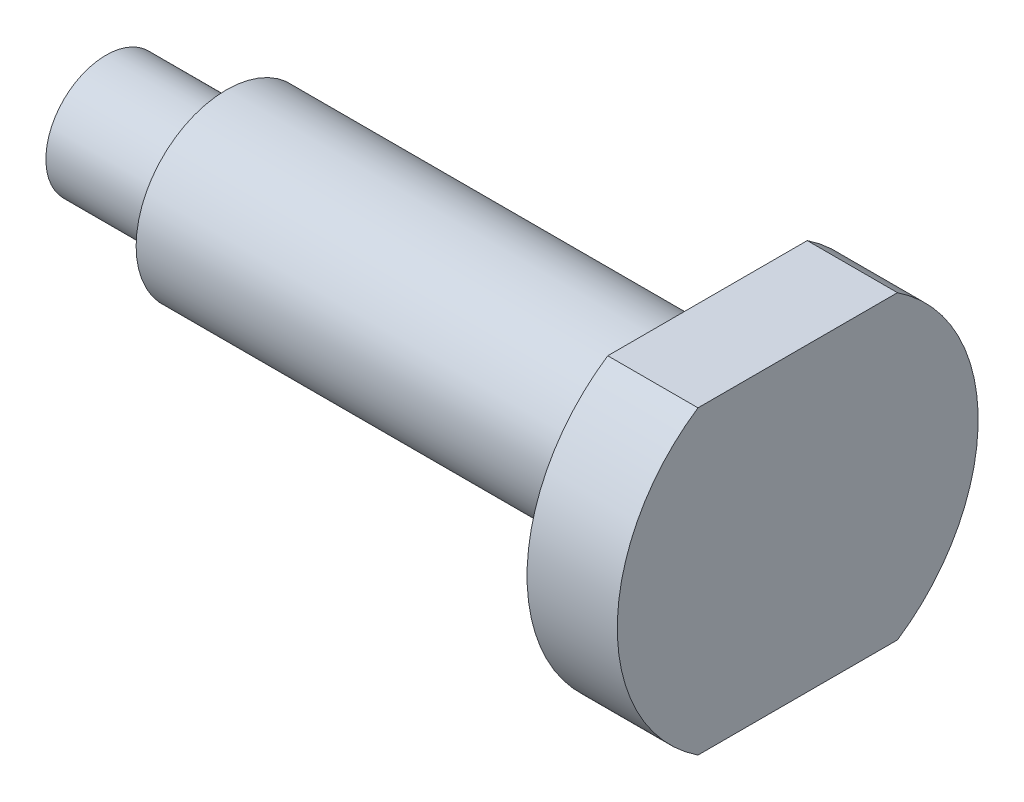
ISO-10303-21;
HEADER;
FILE_DESCRIPTION(('STEP AP214'),'2;1');
FILE_NAME('part.step','',(''),(''),'','','');
FILE_SCHEMA(('AUTOMOTIVE_DESIGN { 1 0 10303 214 1 1 1 1 }'));
ENDSEC;
DATA;
#1=APPLICATION_CONTEXT('core data for automotive mechanical design processes');
#2=APPLICATION_PROTOCOL_DEFINITION('international standard','automotive_design',2000,#1);
#3=PRODUCT_CONTEXT('',#1,'mechanical');
#4=PRODUCT('Part','Part','',(#3));
#5=PRODUCT_RELATED_PRODUCT_CATEGORY('part','',(#4));
#6=PRODUCT_DEFINITION_FORMATION('','',#4);
#7=PRODUCT_DEFINITION_CONTEXT('part definition',#1,'design');
#8=PRODUCT_DEFINITION('design','',#6,#7);
#9=PRODUCT_DEFINITION_SHAPE('','',#8);
#10=(LENGTH_UNIT() NAMED_UNIT(*) SI_UNIT(.MILLI.,.METRE.));
#11=(NAMED_UNIT(*) PLANE_ANGLE_UNIT() SI_UNIT($,.RADIAN.));
#12=(NAMED_UNIT(*) SI_UNIT($,.STERADIAN.) SOLID_ANGLE_UNIT());
#13=UNCERTAINTY_MEASURE_WITH_UNIT(LENGTH_MEASURE(1.E-05),#10,'distance_accuracy_value','');
#14=(GEOMETRIC_REPRESENTATION_CONTEXT(3) GLOBAL_UNCERTAINTY_ASSIGNED_CONTEXT((#13)) GLOBAL_UNIT_ASSIGNED_CONTEXT((#10,
#11,#12)) REPRESENTATION_CONTEXT('',''));
#15=CARTESIAN_POINT('',(0.,0.,0.));
#16=DIRECTION('',(0.,0.,1.));
#17=DIRECTION('',(1.,0.,0.));
#18=AXIS2_PLACEMENT_3D('',#15,#16,#17);
#19=CARTESIAN_POINT('',(3.,5.,0.));
#20=DIRECTION('',(0.,1.,0.));
#21=DIRECTION('',(0.,0.,1.));
#22=AXIS2_PLACEMENT_3D('',#19,#20,#21);
#23=PLANE('',#22);
#24=DIRECTION('',(0.,0.,-1.));
#25=VECTOR('',#24,1.);
#26=CARTESIAN_POINT('',(0.,5.,0.));
#27=LINE('',#26,#25);
#28=CARTESIAN_POINT('',(0.,5.,3.3166247903554));
#29=VERTEX_POINT('',#28);
#30=CARTESIAN_POINT('',(0.,5.,-3.3166247903554));
#31=VERTEX_POINT('',#30);
#32=EDGE_CURVE('E130',#29,#31,#27,.T.);
#33=ORIENTED_EDGE('',*,*,#32,.F.);
#34=DIRECTION('',(-1.,0.,0.));
#35=VECTOR('',#34,1.);
#36=CARTESIAN_POINT('',(3.,5.,3.3166247903554));
#37=LINE('',#36,#35);
#38=CARTESIAN_POINT('',(3.,5.,3.3166247903554));
#39=VERTEX_POINT('',#38);
#40=EDGE_CURVE('E96',#39,#29,#37,.T.);
#41=ORIENTED_EDGE('',*,*,#40,.F.);
#42=DIRECTION('',(0.,0.,-1.));
#43=VECTOR('',#42,1.);
#44=CARTESIAN_POINT('',(3.,5.,0.));
#45=LINE('',#44,#43);
#46=CARTESIAN_POINT('',(3.,5.,-3.3166247903554));
#47=VERTEX_POINT('',#46);
#48=EDGE_CURVE('E109',#39,#47,#45,.T.);
#49=ORIENTED_EDGE('',*,*,#48,.T.);
#50=DIRECTION('',(-1.,0.,0.));
#51=VECTOR('',#50,1.);
#52=CARTESIAN_POINT('',(3.,5.,-3.3166247903554));
#53=LINE('',#52,#51);
#54=EDGE_CURVE('E72',#47,#31,#53,.T.);
#55=ORIENTED_EDGE('',*,*,#54,.T.);
#56=EDGE_LOOP('',(#33,#41,#49,#55));
#57=FACE_BOUND('',#56,.T.);
#58=ADVANCED_FACE('F63',(#57),#23,.T.);
#59=CARTESIAN_POINT('',(0.,0.,0.));
#60=DIRECTION('',(1.,0.,0.));
#61=DIRECTION('',(0.,0.,-1.));
#62=AXIS2_PLACEMENT_3D('',#59,#60,#61);
#63=PLANE('',#62);
#64=CARTESIAN_POINT('',(0.,0.,0.));
#65=DIRECTION('',(1.,0.,0.));
#66=DIRECTION('',(0.,0.,-1.));
#67=AXIS2_PLACEMENT_3D('',#64,#65,#66);
#68=CIRCLE('',#67,3.);
#69=CARTESIAN_POINT('',(0.,0.,-3.));
#70=VERTEX_POINT('',#69);
#71=EDGE_CURVE('E252',#70,#70,#68,.T.);
#72=ORIENTED_EDGE('',*,*,#71,.T.);
#73=EDGE_LOOP('',(#72));
#74=FACE_BOUND('',#73,.T.);
#75=DIRECTION('',(0.,0.,-1.));
#76=VECTOR('',#75,1.);
#77=CARTESIAN_POINT('',(0.,-5.,0.));
#78=LINE('',#77,#76);
#79=CARTESIAN_POINT('',(0.,-5.,3.3166247903554));
#80=VERTEX_POINT('',#79);
#81=CARTESIAN_POINT('',(0.,-5.,-3.3166247903554));
#82=VERTEX_POINT('',#81);
#83=EDGE_CURVE('E125',#80,#82,#78,.T.);
#84=ORIENTED_EDGE('',*,*,#83,.F.);
#85=CARTESIAN_POINT('',(0.,0.,0.));
#86=DIRECTION('',(1.,0.,0.));
#87=DIRECTION('',(0.,0.,-1.));
#88=AXIS2_PLACEMENT_3D('',#85,#86,#87);
#89=CIRCLE('',#88,6.);
#90=EDGE_CURVE('E99',#29,#80,#89,.T.);
#91=ORIENTED_EDGE('',*,*,#90,.F.);
#92=ORIENTED_EDGE('',*,*,#32,.T.);
#93=CARTESIAN_POINT('',(0.,0.,0.));
#94=DIRECTION('',(1.,0.,0.));
#95=DIRECTION('',(0.,0.,-1.));
#96=AXIS2_PLACEMENT_3D('',#93,#94,#95);
#97=CIRCLE('',#96,6.);
#98=EDGE_CURVE('E116',#82,#31,#97,.T.);
#99=ORIENTED_EDGE('',*,*,#98,.F.);
#100=EDGE_LOOP('',(#84,#91,#92,#99));
#101=FACE_BOUND('',#100,.T.);
#102=ADVANCED_FACE('F137',(#74,#101),#63,.F.);
#103=CARTESIAN_POINT('',(3.,0.,0.));
#104=DIRECTION('',(-1.,0.,0.));
#105=DIRECTION('',(0.,0.,1.));
#106=AXIS2_PLACEMENT_3D('',#103,#104,#105);
#107=CYLINDRICAL_SURFACE('',#106,6.);
#108=ORIENTED_EDGE('',*,*,#98,.T.);
#109=ORIENTED_EDGE('',*,*,#54,.F.);
#110=CARTESIAN_POINT('',(3.,0.,0.));
#111=DIRECTION('',(1.,0.,0.));
#112=DIRECTION('',(0.,0.,-1.));
#113=AXIS2_PLACEMENT_3D('',#110,#111,#112);
#114=CIRCLE('',#113,6.);
#115=CARTESIAN_POINT('',(3.,-5.,-3.3166247903554));
#116=VERTEX_POINT('',#115);
#117=EDGE_CURVE('E106',#116,#47,#114,.T.);
#118=ORIENTED_EDGE('',*,*,#117,.F.);
#119=DIRECTION('',(-1.,0.,0.));
#120=VECTOR('',#119,1.);
#121=CARTESIAN_POINT('',(3.,-5.,-3.3166247903554));
#122=LINE('',#121,#120);
#123=EDGE_CURVE('E12',#116,#82,#122,.T.);
#124=ORIENTED_EDGE('',*,*,#123,.T.);
#125=EDGE_LOOP('',(#108,#109,#118,#124));
#126=FACE_BOUND('',#125,.T.);
#127=ADVANCED_FACE('F115',(#126),#107,.T.);
#128=CARTESIAN_POINT('',(3.,-5.,0.));
#129=DIRECTION('',(0.,1.,0.));
#130=DIRECTION('',(0.,0.,1.));
#131=AXIS2_PLACEMENT_3D('',#128,#129,#130);
#132=PLANE('',#131);
#133=ORIENTED_EDGE('',*,*,#83,.T.);
#134=ORIENTED_EDGE('',*,*,#123,.F.);
#135=DIRECTION('',(0.,0.,-1.));
#136=VECTOR('',#135,1.);
#137=CARTESIAN_POINT('',(3.,-5.,0.));
#138=LINE('',#137,#136);
#139=CARTESIAN_POINT('',(3.,-5.,3.3166247903554));
#140=VERTEX_POINT('',#139);
#141=EDGE_CURVE('E111',#140,#116,#138,.T.);
#142=ORIENTED_EDGE('',*,*,#141,.F.);
#143=DIRECTION('',(-1.,0.,0.));
#144=VECTOR('',#143,1.);
#145=CARTESIAN_POINT('',(3.,-5.,3.3166247903554));
#146=LINE('',#145,#144);
#147=EDGE_CURVE('E121',#140,#80,#146,.T.);
#148=ORIENTED_EDGE('',*,*,#147,.T.);
#149=EDGE_LOOP('',(#133,#134,#142,#148));
#150=FACE_BOUND('',#149,.T.);
#151=ADVANCED_FACE('F65',(#150),#132,.F.);
#152=CARTESIAN_POINT('',(3.,0.,0.));
#153=DIRECTION('',(-1.,0.,0.));
#154=DIRECTION('',(0.,0.,1.));
#155=AXIS2_PLACEMENT_3D('',#152,#153,#154);
#156=CYLINDRICAL_SURFACE('',#155,6.);
#157=ORIENTED_EDGE('',*,*,#90,.T.);
#158=ORIENTED_EDGE('',*,*,#147,.F.);
#159=CARTESIAN_POINT('',(3.,0.,0.));
#160=DIRECTION('',(1.,0.,0.));
#161=DIRECTION('',(0.,0.,-1.));
#162=AXIS2_PLACEMENT_3D('',#159,#160,#161);
#163=CIRCLE('',#162,6.);
#164=EDGE_CURVE('E80',#39,#140,#163,.T.);
#165=ORIENTED_EDGE('',*,*,#164,.F.);
#166=ORIENTED_EDGE('',*,*,#40,.T.);
#167=EDGE_LOOP('',(#157,#158,#165,#166));
#168=FACE_BOUND('',#167,.T.);
#169=ADVANCED_FACE('F150',(#168),#156,.T.);
#170=CARTESIAN_POINT('',(3.,0.,0.));
#171=DIRECTION('',(1.,0.,0.));
#172=DIRECTION('',(0.,0.,-1.));
#173=AXIS2_PLACEMENT_3D('',#170,#171,#172);
#174=PLANE('',#173);
#175=ORIENTED_EDGE('',*,*,#141,.T.);
#176=ORIENTED_EDGE('',*,*,#117,.T.);
#177=ORIENTED_EDGE('',*,*,#48,.F.);
#178=ORIENTED_EDGE('',*,*,#164,.T.);
#179=EDGE_LOOP('',(#175,#176,#177,#178));
#180=FACE_BOUND('',#179,.T.);
#181=ADVANCED_FACE('F107',(#180),#174,.T.);
#182=CARTESIAN_POINT('',(-16.,0.,0.));
#183=DIRECTION('',(1.,0.,0.));
#184=DIRECTION('',(0.,0.,-1.));
#185=AXIS2_PLACEMENT_3D('',#182,#183,#184);
#186=CYLINDRICAL_SURFACE('',#185,3.);
#187=CARTESIAN_POINT('',(-16.,0.,0.));
#188=DIRECTION('',(1.,0.,0.));
#189=DIRECTION('',(0.,0.,-1.));
#190=AXIS2_PLACEMENT_3D('',#187,#188,#189);
#191=CIRCLE('',#190,3.);
#192=CARTESIAN_POINT('',(-16.,0.,-3.));
#193=VERTEX_POINT('',#192);
#194=EDGE_CURVE('E128',#193,#193,#191,.T.);
#195=ORIENTED_EDGE('',*,*,#194,.T.);
#196=EDGE_LOOP('',(#195));
#197=FACE_BOUND('',#196,.T.);
#198=ORIENTED_EDGE('',*,*,#71,.F.);
#199=EDGE_LOOP('',(#198));
#200=FACE_BOUND('',#199,.T.);
#201=ADVANCED_FACE('F156',(#197,#200),#186,.T.);
#202=CARTESIAN_POINT('',(-16.,0.,0.));
#203=DIRECTION('',(1.,0.,0.));
#204=DIRECTION('',(0.,0.,-1.));
#205=AXIS2_PLACEMENT_3D('',#202,#203,#204);
#206=PLANE('',#205);
#207=CARTESIAN_POINT('',(-16.,0.,0.));
#208=DIRECTION('',(1.,0.,0.));
#209=DIRECTION('',(0.,0.,-1.));
#210=AXIS2_PLACEMENT_3D('',#207,#208,#209);
#211=CIRCLE('',#210,2.);
#212=CARTESIAN_POINT('',(-16.,0.,-2.));
#213=VERTEX_POINT('',#212);
#214=EDGE_CURVE('E249',#213,#213,#211,.T.);
#215=ORIENTED_EDGE('',*,*,#214,.T.);
#216=EDGE_LOOP('',(#215));
#217=FACE_BOUND('',#216,.T.);
#218=ORIENTED_EDGE('',*,*,#194,.F.);
#219=EDGE_LOOP('',(#218));
#220=FACE_BOUND('',#219,.T.);
#221=ADVANCED_FACE('F201',(#217,#220),#206,.F.);
#222=CARTESIAN_POINT('',(-20.,0.,0.));
#223=DIRECTION('',(1.,0.,0.));
#224=DIRECTION('',(0.,0.,-1.));
#225=AXIS2_PLACEMENT_3D('',#222,#223,#224);
#226=CYLINDRICAL_SURFACE('',#225,2.);
#227=CARTESIAN_POINT('',(-20.,0.,0.));
#228=DIRECTION('',(1.,0.,0.));
#229=DIRECTION('',(0.,0.,-1.));
#230=AXIS2_PLACEMENT_3D('',#227,#228,#229);
#231=CIRCLE('',#230,2.);
#232=CARTESIAN_POINT('',(-20.,0.,-2.));
#233=VERTEX_POINT('',#232);
#234=EDGE_CURVE('E248',#233,#233,#231,.T.);
#235=ORIENTED_EDGE('',*,*,#234,.T.);
#236=EDGE_LOOP('',(#235));
#237=FACE_BOUND('',#236,.T.);
#238=ORIENTED_EDGE('',*,*,#214,.F.);
#239=EDGE_LOOP('',(#238));
#240=FACE_BOUND('',#239,.T.);
#241=ADVANCED_FACE('F211',(#237,#240),#226,.T.);
#242=CARTESIAN_POINT('',(-20.,0.,0.));
#243=DIRECTION('',(1.,0.,0.));
#244=DIRECTION('',(0.,0.,-1.));
#245=AXIS2_PLACEMENT_3D('',#242,#243,#244);
#246=PLANE('',#245);
#247=ORIENTED_EDGE('',*,*,#234,.F.);
#248=EDGE_LOOP('',(#247));
#249=FACE_BOUND('',#248,.T.);
#250=ADVANCED_FACE('F222',(#249),#246,.F.);
#251=CLOSED_SHELL('',(#58,#102,#127,#151,#169,#181,#201,#221,#241,#250));
#252=MANIFOLD_SOLID_BREP('B2',#251);
#253=ADVANCED_BREP_SHAPE_REPRESENTATION('',(#18,#252),#14);
#254=SHAPE_DEFINITION_REPRESENTATION(#9,#253);
ENDSEC;
END-ISO-10303-21;
